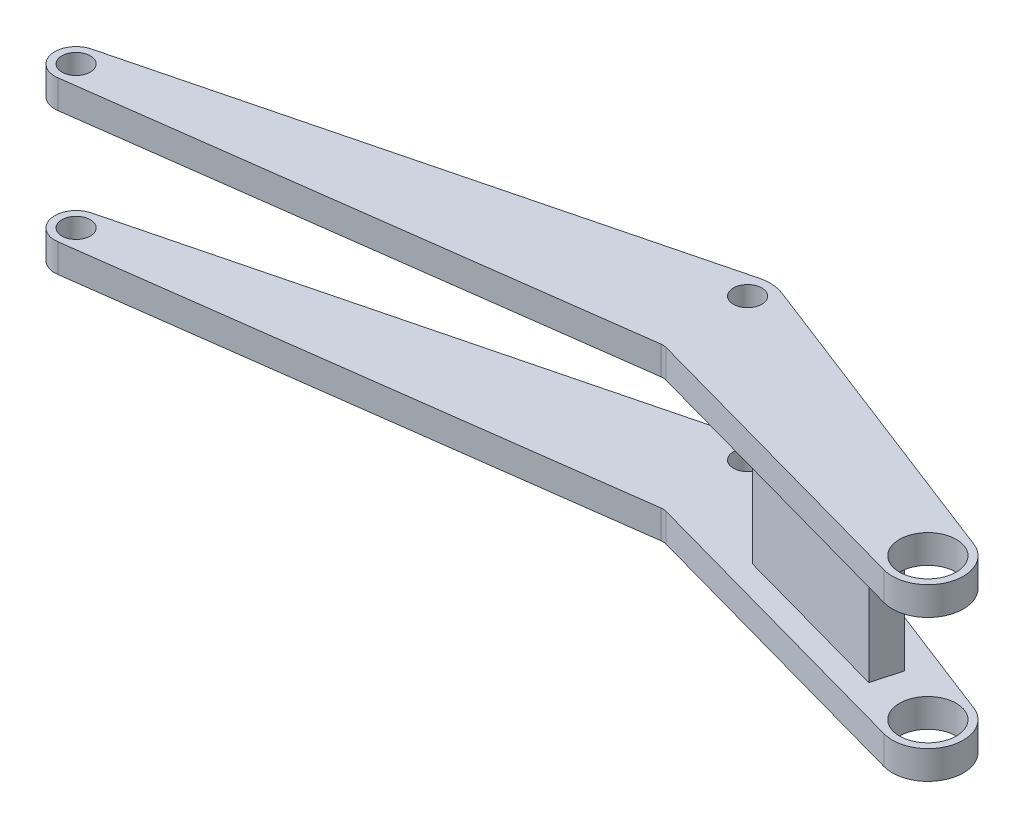
ISO-10303-21;
HEADER;
FILE_DESCRIPTION(('STEP AP214'),'2;1');
FILE_NAME('part.step','',(''),(''),'','','');
FILE_SCHEMA(('AUTOMOTIVE_DESIGN { 1 0 10303 214 1 1 1 1 }'));
ENDSEC;
DATA;
#1=APPLICATION_CONTEXT('core data for automotive mechanical design processes');
#2=APPLICATION_PROTOCOL_DEFINITION('international standard','automotive_design',2000,#1);
#3=PRODUCT_CONTEXT('',#1,'mechanical');
#4=PRODUCT('Part','Part','',(#3));
#5=PRODUCT_RELATED_PRODUCT_CATEGORY('part','',(#4));
#6=PRODUCT_DEFINITION_FORMATION('','',#4);
#7=PRODUCT_DEFINITION_CONTEXT('part definition',#1,'design');
#8=PRODUCT_DEFINITION('design','',#6,#7);
#9=PRODUCT_DEFINITION_SHAPE('','',#8);
#10=(LENGTH_UNIT() NAMED_UNIT(*) SI_UNIT(.MILLI.,.METRE.));
#11=(NAMED_UNIT(*) PLANE_ANGLE_UNIT() SI_UNIT($,.RADIAN.));
#12=(NAMED_UNIT(*) SI_UNIT($,.STERADIAN.) SOLID_ANGLE_UNIT());
#13=UNCERTAINTY_MEASURE_WITH_UNIT(LENGTH_MEASURE(1.E-05),#10,'distance_accuracy_value','');
#14=(GEOMETRIC_REPRESENTATION_CONTEXT(3) GLOBAL_UNCERTAINTY_ASSIGNED_CONTEXT((#13)) GLOBAL_UNIT_ASSIGNED_CONTEXT((#10,
#11,#12)) REPRESENTATION_CONTEXT('',''));
#15=CARTESIAN_POINT('',(0.,0.,0.));
#16=DIRECTION('',(0.,0.,1.));
#17=DIRECTION('',(1.,0.,0.));
#18=AXIS2_PLACEMENT_3D('',#15,#16,#17);
#19=CARTESIAN_POINT('',(-61.8184918272129,60.,0.));
#20=DIRECTION('',(0.,-1.,0.));
#21=DIRECTION('',(0.,0.,-1.));
#22=AXIS2_PLACEMENT_3D('',#19,#20,#21);
#23=CYLINDRICAL_SURFACE('',#22,7.5);
#24=CARTESIAN_POINT('',(-61.8184918272129,10.,0.));
#25=DIRECTION('',(0.,1.,0.));
#26=DIRECTION('',(0.,0.,1.));
#27=AXIS2_PLACEMENT_3D('',#24,#25,#26);
#28=CIRCLE('',#27,7.5);
#29=CARTESIAN_POINT('',(-63.6672105774605,10.,-7.26857888328131));
#30=VERTEX_POINT('',#29);
#31=CARTESIAN_POINT('',(-60.826924457407,10.,7.43416398468155));
#32=VERTEX_POINT('',#31);
#33=EDGE_CURVE('E259',#30,#32,#28,.T.);
#34=ORIENTED_EDGE('',*,*,#33,.F.);
#35=DIRECTION('',(0.,-1.,0.));
#36=VECTOR('',#35,1.);
#37=CARTESIAN_POINT('',(-63.6672105774605,60.,-7.26857888328131));
#38=LINE('',#37,#36);
#39=CARTESIAN_POINT('',(-63.6672105774605,0.,-7.26857888328131));
#40=VERTEX_POINT('',#39);
#41=EDGE_CURVE('E288',#30,#40,#38,.T.);
#42=ORIENTED_EDGE('',*,*,#41,.T.);
#43=CARTESIAN_POINT('',(-61.8184918272129,0.,0.));
#44=DIRECTION('',(0.,1.,0.));
#45=DIRECTION('',(0.,0.,1.));
#46=AXIS2_PLACEMENT_3D('',#43,#44,#45);
#47=CIRCLE('',#46,7.5);
#48=CARTESIAN_POINT('',(-60.826924457407,0.,7.43416398468155));
#49=VERTEX_POINT('',#48);
#50=EDGE_CURVE('E269',#40,#49,#47,.T.);
#51=ORIENTED_EDGE('',*,*,#50,.T.);
#52=DIRECTION('',(0.,-1.,0.));
#53=VECTOR('',#52,1.);
#54=CARTESIAN_POINT('',(-60.826924457407,60.,7.43416398468155));
#55=LINE('',#54,#53);
#56=EDGE_CURVE('E42',#32,#49,#55,.T.);
#57=ORIENTED_EDGE('',*,*,#56,.F.);
#58=EDGE_LOOP('',(#34,#42,#51,#57));
#59=FACE_BOUND('',#58,.T.);
#60=ADVANCED_FACE('F33',(#59),#23,.T.);
#61=CARTESIAN_POINT('',(-60.826924457407,60.,7.43416398468155));
#62=DIRECTION('',(-0.132208982640787,0.,-0.991221864624206));
#63=DIRECTION('',(-0.991221864624206,0.,0.132208982640787));
#64=AXIS2_PLACEMENT_3D('',#61,#62,#63);
#65=PLANE('',#64);
#66=DIRECTION('',(0.991221864624206,0.,-0.132208982640787));
#67=VECTOR('',#66,1.);
#68=CARTESIAN_POINT('',(-60.826924457407,10.,7.43416398468155));
#69=LINE('',#68,#67);
#70=CARTESIAN_POINT('',(126.580977140367,10.,-17.5622660713482));
#71=VERTEX_POINT('',#70);
#72=EDGE_CURVE('E257',#32,#71,#69,.T.);
#73=ORIENTED_EDGE('',*,*,#72,.F.);
#74=ORIENTED_EDGE('',*,*,#56,.T.);
#75=DIRECTION('',(0.991221864624206,0.,-0.132208982640787));
#76=VECTOR('',#75,1.);
#77=CARTESIAN_POINT('',(-60.826924457407,0.,7.43416398468155));
#78=LINE('',#77,#76);
#79=CARTESIAN_POINT('',(126.580977140367,0.,-17.5622660713482));
#80=VERTEX_POINT('',#79);
#81=EDGE_CURVE('E291',#49,#80,#78,.T.);
#82=ORIENTED_EDGE('',*,*,#81,.T.);
#83=DIRECTION('',(0.,-1.,0.));
#84=VECTOR('',#83,1.);
#85=CARTESIAN_POINT('',(126.580977140367,60.,-17.5622660713482));
#86=LINE('',#85,#84);
#87=EDGE_CURVE('E334',#71,#80,#86,.T.);
#88=ORIENTED_EDGE('',*,*,#87,.F.);
#89=EDGE_LOOP('',(#73,#74,#82,#88));
#90=FACE_BOUND('',#89,.T.);
#91=ADVANCED_FACE('F371',(#90),#65,.F.);
#92=CARTESIAN_POINT('',(127.242022053571,60.,-12.6061567482272));
#93=DIRECTION('',(0.,-1.,0.));
#94=DIRECTION('',(0.,0.,-1.));
#95=AXIS2_PLACEMENT_3D('',#92,#93,#94);
#96=CYLINDRICAL_SURFACE('',#95,4.99999999999999);
#97=CARTESIAN_POINT('',(127.242022053571,10.,-12.6061567482272));
#98=DIRECTION('',(0.,1.,0.));
#99=DIRECTION('',(0.,0.,1.));
#100=AXIS2_PLACEMENT_3D('',#97,#98,#99);
#101=CIRCLE('',#100,4.99999999999999);
#102=CARTESIAN_POINT('',(128.578230905402,10.,-17.4243043076414));
#103=VERTEX_POINT('',#102);
#104=EDGE_CURVE('E255',#71,#103,#101,.F.);
#105=ORIENTED_EDGE('',*,*,#104,.F.);
#106=ORIENTED_EDGE('',*,*,#87,.T.);
#107=CARTESIAN_POINT('',(127.242022053571,0.,-12.6061567482272));
#108=DIRECTION('',(0.,-1.,0.));
#109=DIRECTION('',(0.,0.,1.));
#110=AXIS2_PLACEMENT_3D('',#107,#108,#109);
#111=CIRCLE('',#110,4.99999999999999);
#112=CARTESIAN_POINT('',(128.578230905402,0.,-17.4243043076414));
#113=VERTEX_POINT('',#112);
#114=EDGE_CURVE('E294',#80,#113,#111,.T.);
#115=ORIENTED_EDGE('',*,*,#114,.T.);
#116=DIRECTION('',(0.,-1.,0.));
#117=VECTOR('',#116,1.);
#118=CARTESIAN_POINT('',(128.578230905402,60.,-17.4243043076414));
#119=LINE('',#118,#117);
#120=EDGE_CURVE('E330',#103,#113,#119,.T.);
#121=ORIENTED_EDGE('',*,*,#120,.F.);
#122=EDGE_LOOP('',(#105,#106,#115,#121));
#123=FACE_BOUND('',#122,.T.);
#124=ADVANCED_FACE('F376',(#123),#96,.F.);
#125=CARTESIAN_POINT('',(128.578230905402,60.,-17.4243043076414));
#126=DIRECTION('',(0.267241770366172,0.,-0.963629511882837));
#127=DIRECTION('',(-0.963629511882837,0.,-0.267241770366172));
#128=AXIS2_PLACEMENT_3D('',#125,#126,#127);
#129=PLANE('',#128);
#130=DIRECTION('',(0.963629511882837,0.,0.267241770366172));
#131=VECTOR('',#130,1.);
#132=CARTESIAN_POINT('',(128.578230905402,10.,-17.4243043076414));
#133=LINE('',#132,#131);
#134=CARTESIAN_POINT('',(234.84098604321,10.,12.0453688985354));
#135=VERTEX_POINT('',#134);
#136=EDGE_CURVE('E253',#103,#135,#133,.T.);
#137=ORIENTED_EDGE('',*,*,#136,.F.);
#138=ORIENTED_EDGE('',*,*,#120,.T.);
#139=DIRECTION('',(0.963629511882837,0.,0.267241770366172));
#140=VECTOR('',#139,1.);
#141=CARTESIAN_POINT('',(128.578230905402,0.,-17.4243043076414));
#142=LINE('',#141,#140);
#143=CARTESIAN_POINT('',(234.84098604321,0.,12.0453688985354));
#144=VERTEX_POINT('',#143);
#145=EDGE_CURVE('E297',#113,#144,#142,.T.);
#146=ORIENTED_EDGE('',*,*,#145,.T.);
#147=DIRECTION('',(0.,-1.,0.));
#148=VECTOR('',#147,1.);
#149=CARTESIAN_POINT('',(234.84098604321,60.,12.0453688985354));
#150=LINE('',#149,#148);
#151=EDGE_CURVE('E326',#135,#144,#150,.T.);
#152=ORIENTED_EDGE('',*,*,#151,.F.);
#153=EDGE_LOOP('',(#137,#138,#146,#152));
#154=FACE_BOUND('',#153,.T.);
#155=ADVANCED_FACE('F438',(#154),#129,.F.);
#156=CARTESIAN_POINT('',(238.181508172787,60.,0.));
#157=DIRECTION('',(0.,-1.,0.));
#158=DIRECTION('',(0.,0.,-1.));
#159=AXIS2_PLACEMENT_3D('',#156,#157,#158);
#160=CYLINDRICAL_SURFACE('',#159,12.5);
#161=CARTESIAN_POINT('',(238.181508172787,10.,0.));
#162=DIRECTION('',(0.,1.,0.));
#163=DIRECTION('',(0.,0.,1.));
#164=AXIS2_PLACEMENT_3D('',#161,#162,#163);
#165=CIRCLE('',#164,12.5);
#166=CARTESIAN_POINT('',(242.697935990641,10.,-11.6555514569715));
#167=VERTEX_POINT('',#166);
#168=EDGE_CURVE('E251',#135,#167,#165,.T.);
#169=ORIENTED_EDGE('',*,*,#168,.F.);
#170=ORIENTED_EDGE('',*,*,#151,.T.);
#171=CARTESIAN_POINT('',(238.181508172787,0.,0.));
#172=DIRECTION('',(0.,1.,0.));
#173=DIRECTION('',(0.,0.,1.));
#174=AXIS2_PLACEMENT_3D('',#171,#172,#173);
#175=CIRCLE('',#174,12.5);
#176=CARTESIAN_POINT('',(242.697935990641,0.,-11.6555514569715));
#177=VERTEX_POINT('',#176);
#178=EDGE_CURVE('E300',#144,#177,#175,.T.);
#179=ORIENTED_EDGE('',*,*,#178,.T.);
#180=DIRECTION('',(0.,-1.,0.));
#181=VECTOR('',#180,1.);
#182=CARTESIAN_POINT('',(242.697935990641,60.,-11.6555514569715));
#183=LINE('',#182,#181);
#184=EDGE_CURVE('E322',#167,#177,#183,.T.);
#185=ORIENTED_EDGE('',*,*,#184,.F.);
#186=EDGE_LOOP('',(#169,#170,#179,#185));
#187=FACE_BOUND('',#186,.T.);
#188=ADVANCED_FACE('F435',(#187),#160,.T.);
#189=CARTESIAN_POINT('',(132.300421209568,60.,-54.4336566903369));
#190=DIRECTION('',(-0.361314225428352,0.,0.932444116557722));
#191=DIRECTION('',(0.932444116557722,0.,0.361314225428352));
#192=AXIS2_PLACEMENT_3D('',#189,#190,#191);
#193=PLANE('',#192);
#194=DIRECTION('',(-0.932444116557722,0.,-0.361314225428352));
#195=VECTOR('',#194,1.);
#196=CARTESIAN_POINT('',(132.300421209568,10.,-54.4336566903369));
#197=LINE('',#196,#195);
#198=CARTESIAN_POINT('',(132.300421209568,10.,-54.4336566903369));
#199=VERTEX_POINT('',#198);
#200=EDGE_CURVE('E249',#167,#199,#197,.T.);
#201=ORIENTED_EDGE('',*,*,#200,.F.);
#202=ORIENTED_EDGE('',*,*,#184,.T.);
#203=DIRECTION('',(-0.932444116557722,0.,-0.361314225428352));
#204=VECTOR('',#203,1.);
#205=CARTESIAN_POINT('',(132.300421209568,0.,-54.4336566903369));
#206=LINE('',#205,#204);
#207=CARTESIAN_POINT('',(132.300421209568,0.,-54.4336566903369));
#208=VERTEX_POINT('',#207);
#209=EDGE_CURVE('E303',#177,#208,#206,.T.);
#210=ORIENTED_EDGE('',*,*,#209,.T.);
#211=DIRECTION('',(0.,-1.,0.));
#212=VECTOR('',#211,1.);
#213=CARTESIAN_POINT('',(132.300421209568,60.,-54.4336566903369));
#214=LINE('',#213,#212);
#215=EDGE_CURVE('E318',#199,#208,#214,.T.);
#216=ORIENTED_EDGE('',*,*,#215,.F.);
#217=EDGE_LOOP('',(#201,#202,#210,#216));
#218=FACE_BOUND('',#217,.T.);
#219=ADVANCED_FACE('F432',(#218),#193,.F.);
#220=CARTESIAN_POINT('',(127.242022053571,60.,-41.3794390585288));
#221=DIRECTION('',(0.,-1.,0.));
#222=DIRECTION('',(0.,0.,-1.));
#223=AXIS2_PLACEMENT_3D('',#220,#221,#222);
#224=CYLINDRICAL_SURFACE('',#223,14.);
#225=CARTESIAN_POINT('',(127.242022053571,10.,-41.3794390585288));
#226=DIRECTION('',(0.,1.,0.));
#227=DIRECTION('',(0.,0.,1.));
#228=AXIS2_PLACEMENT_3D('',#225,#226,#227);
#229=CIRCLE('',#228,14.);
#230=CARTESIAN_POINT('',(123.791080386442,10.,-54.9474529739872));
#231=VERTEX_POINT('',#230);
#232=EDGE_CURVE('E50',#199,#231,#229,.T.);
#233=ORIENTED_EDGE('',*,*,#232,.F.);
#234=ORIENTED_EDGE('',*,*,#215,.T.);
#235=CARTESIAN_POINT('',(127.242022053571,0.,-41.3794390585288));
#236=DIRECTION('',(0.,1.,0.));
#237=DIRECTION('',(0.,0.,1.));
#238=AXIS2_PLACEMENT_3D('',#235,#236,#237);
#239=CIRCLE('',#238,14.);
#240=CARTESIAN_POINT('',(123.791080386442,0.,-54.9474529739872));
#241=VERTEX_POINT('',#240);
#242=EDGE_CURVE('E306',#208,#241,#239,.T.);
#243=ORIENTED_EDGE('',*,*,#242,.T.);
#244=DIRECTION('',(0.,-1.,0.));
#245=VECTOR('',#244,1.);
#246=CARTESIAN_POINT('',(123.791080386442,60.,-54.9474529739872));
#247=LINE('',#246,#245);
#248=EDGE_CURVE('E314',#231,#241,#247,.T.);
#249=ORIENTED_EDGE('',*,*,#248,.F.);
#250=EDGE_LOOP('',(#233,#234,#243,#249));
#251=FACE_BOUND('',#250,.T.);
#252=ADVANCED_FACE('F429',(#251),#224,.T.);
#253=CARTESIAN_POINT('',(-63.6672105774605,60.,-7.26857888328131));
#254=DIRECTION('',(0.246495833366344,0.,0.969143851104175));
#255=DIRECTION('',(0.969143851104175,0.,-0.246495833366344));
#256=AXIS2_PLACEMENT_3D('',#253,#254,#255);
#257=PLANE('',#256);
#258=DIRECTION('',(-0.969143851104175,0.,0.246495833366344));
#259=VECTOR('',#258,1.);
#260=CARTESIAN_POINT('',(-63.6672105774605,10.,-7.26857888328131));
#261=LINE('',#260,#259);
#262=EDGE_CURVE('E246',#231,#30,#261,.T.);
#263=ORIENTED_EDGE('',*,*,#262,.F.);
#264=ORIENTED_EDGE('',*,*,#248,.T.);
#265=DIRECTION('',(-0.969143851104175,0.,0.246495833366344));
#266=VECTOR('',#265,1.);
#267=CARTESIAN_POINT('',(-63.6672105774605,0.,-7.26857888328131));
#268=LINE('',#267,#266);
#269=EDGE_CURVE('E274',#241,#40,#268,.T.);
#270=ORIENTED_EDGE('',*,*,#269,.T.);
#271=ORIENTED_EDGE('',*,*,#41,.F.);
#272=EDGE_LOOP('',(#263,#264,#270,#271));
#273=FACE_BOUND('',#272,.T.);
#274=ADVANCED_FACE('F360',(#273),#257,.F.);
#275=CARTESIAN_POINT('',(-61.8184918272129,-68.5,0.));
#276=DIRECTION('',(0.,1.,0.));
#277=DIRECTION('',(0.,0.,1.));
#278=AXIS2_PLACEMENT_3D('',#275,#276,#277);
#279=CYLINDRICAL_SURFACE('',#278,5.);
#280=CARTESIAN_POINT('',(-61.8184918272129,0.,0.));
#281=DIRECTION('',(0.,1.,0.));
#282=DIRECTION('',(0.,0.,1.));
#283=AXIS2_PLACEMENT_3D('',#280,#281,#282);
#284=CIRCLE('',#283,5.);
#285=CARTESIAN_POINT('',(-61.8184918272129,0.,5.));
#286=VERTEX_POINT('',#285);
#287=EDGE_CURVE('E261',#286,#286,#284,.T.);
#288=ORIENTED_EDGE('',*,*,#287,.F.);
#289=EDGE_LOOP('',(#288));
#290=FACE_BOUND('',#289,.T.);
#291=CARTESIAN_POINT('',(-61.8184918272129,10.,0.));
#292=DIRECTION('',(0.,1.,0.));
#293=DIRECTION('',(0.,0.,1.));
#294=AXIS2_PLACEMENT_3D('',#291,#292,#293);
#295=CIRCLE('',#294,5.);
#296=CARTESIAN_POINT('',(-61.8184918272129,10.,5.));
#297=VERTEX_POINT('',#296);
#298=EDGE_CURVE('E243',#297,#297,#295,.F.);
#299=ORIENTED_EDGE('',*,*,#298,.F.);
#300=EDGE_LOOP('',(#299));
#301=FACE_BOUND('',#300,.T.);
#302=ADVANCED_FACE('F350',(#290,#301),#279,.F.);
#303=CARTESIAN_POINT('',(238.181508172787,-68.5,0.));
#304=DIRECTION('',(0.,1.,0.));
#305=DIRECTION('',(0.,0.,1.));
#306=AXIS2_PLACEMENT_3D('',#303,#304,#305);
#307=CYLINDRICAL_SURFACE('',#306,10.);
#308=CARTESIAN_POINT('',(238.181508172787,0.,0.));
#309=DIRECTION('',(0.,1.,0.));
#310=DIRECTION('',(0.,0.,1.));
#311=AXIS2_PLACEMENT_3D('',#308,#309,#310);
#312=CIRCLE('',#311,10.);
#313=CARTESIAN_POINT('',(238.181508172787,0.,10.));
#314=VERTEX_POINT('',#313);
#315=EDGE_CURVE('E265',#314,#314,#312,.T.);
#316=ORIENTED_EDGE('',*,*,#315,.F.);
#317=EDGE_LOOP('',(#316));
#318=FACE_BOUND('',#317,.T.);
#319=CARTESIAN_POINT('',(238.181508172787,10.,0.));
#320=DIRECTION('',(0.,1.,0.));
#321=DIRECTION('',(0.,0.,1.));
#322=AXIS2_PLACEMENT_3D('',#319,#320,#321);
#323=CIRCLE('',#322,10.);
#324=CARTESIAN_POINT('',(238.181508172787,10.,10.));
#325=VERTEX_POINT('',#324);
#326=EDGE_CURVE('E242',#325,#325,#323,.F.);
#327=ORIENTED_EDGE('',*,*,#326,.F.);
#328=EDGE_LOOP('',(#327));
#329=FACE_BOUND('',#328,.T.);
#330=ADVANCED_FACE('F347',(#318,#329),#307,.F.);
#331=CARTESIAN_POINT('',(-61.8184918272129,0.,0.));
#332=DIRECTION('',(0.,1.,0.));
#333=DIRECTION('',(0.,0.,1.));
#334=AXIS2_PLACEMENT_3D('',#331,#332,#333);
#335=PLANE('',#334);
#336=CARTESIAN_POINT('',(127.242022053571,0.,-47.441126230127));
#337=DIRECTION('',(0.,1.,0.));
#338=DIRECTION('',(0.,0.,1.));
#339=AXIS2_PLACEMENT_3D('',#336,#337,#338);
#340=CIRCLE('',#339,4.99999999999999);
#341=CARTESIAN_POINT('',(127.242022053571,0.,-42.441126230127));
#342=VERTEX_POINT('',#341);
#343=EDGE_CURVE('E203',#342,#342,#340,.T.);
#344=ORIENTED_EDGE('',*,*,#343,.T.);
#345=EDGE_LOOP('',(#344));
#346=FACE_BOUND('',#345,.T.);
#347=ORIENTED_EDGE('',*,*,#315,.T.);
#348=EDGE_LOOP('',(#347));
#349=FACE_BOUND('',#348,.T.);
#350=ORIENTED_EDGE('',*,*,#287,.T.);
#351=EDGE_LOOP('',(#350));
#352=FACE_BOUND('',#351,.T.);
#353=ORIENTED_EDGE('',*,*,#50,.F.);
#354=ORIENTED_EDGE('',*,*,#269,.F.);
#355=ORIENTED_EDGE('',*,*,#242,.F.);
#356=ORIENTED_EDGE('',*,*,#209,.F.);
#357=ORIENTED_EDGE('',*,*,#178,.F.);
#358=ORIENTED_EDGE('',*,*,#145,.F.);
#359=ORIENTED_EDGE('',*,*,#114,.F.);
#360=ORIENTED_EDGE('',*,*,#81,.F.);
#361=EDGE_LOOP('',(#353,#354,#355,#356,#357,#358,#359,#360));
#362=FACE_BOUND('',#361,.T.);
#363=ADVANCED_FACE('F349',(#346,#349,#352,#362),#335,.F.);
#364=CARTESIAN_POINT('',(0.,10.,0.));
#365=DIRECTION('',(0.,1.,0.));
#366=DIRECTION('',(0.,0.,1.));
#367=AXIS2_PLACEMENT_3D('',#364,#365,#366);
#368=PLANE('',#367);
#369=CARTESIAN_POINT('',(127.242022053571,10.,-47.441126230127));
#370=DIRECTION('',(0.,1.,0.));
#371=DIRECTION('',(0.,0.,1.));
#372=AXIS2_PLACEMENT_3D('',#369,#370,#371);
#373=CIRCLE('',#372,4.99999999999999);
#374=CARTESIAN_POINT('',(127.242022053571,10.,-42.441126230127));
#375=VERTEX_POINT('',#374);
#376=EDGE_CURVE('E672',#375,#375,#373,.T.);
#377=ORIENTED_EDGE('',*,*,#376,.F.);
#378=EDGE_LOOP('',(#377));
#379=FACE_BOUND('',#378,.T.);
#380=ORIENTED_EDGE('',*,*,#298,.T.);
#381=EDGE_LOOP('',(#380));
#382=FACE_BOUND('',#381,.T.);
#383=ORIENTED_EDGE('',*,*,#326,.T.);
#384=EDGE_LOOP('',(#383));
#385=FACE_BOUND('',#384,.T.);
#386=DIRECTION('',(-0.932444116557722,0.,-0.361314225428352));
#387=VECTOR('',#386,1.);
#388=CARTESIAN_POINT('',(219.199055148742,10.,-10.7417659280512));
#389=LINE('',#388,#387);
#390=CARTESIAN_POINT('',(219.199055148742,10.,-10.7417659280512));
#391=VERTEX_POINT('',#390);
#392=CARTESIAN_POINT('',(164.034407851245,10.,-32.117601171567));
#393=VERTEX_POINT('',#392);
#394=EDGE_CURVE('E183',#391,#393,#389,.T.);
#395=ORIENTED_EDGE('',*,*,#394,.F.);
#396=DIRECTION('',(0.267241770366172,0.,-0.963629511882837));
#397=VECTOR('',#396,1.);
#398=CARTESIAN_POINT('',(216.469846147847,10.,-0.900690808114779));
#399=LINE('',#398,#397);
#400=CARTESIAN_POINT('',(216.469846147847,10.,-0.900690808114772));
#401=VERTEX_POINT('',#400);
#402=EDGE_CURVE('E192',#401,#391,#399,.T.);
#403=ORIENTED_EDGE('',*,*,#402,.F.);
#404=DIRECTION('',(0.963629511882837,0.,0.267241770366172));
#405=VECTOR('',#404,1.);
#406=CARTESIAN_POINT('',(159.740207612292,10.,-16.6334271424893));
#407=LINE('',#406,#405);
#408=CARTESIAN_POINT('',(159.740207612292,10.,-16.6334271424893));
#409=VERTEX_POINT('',#408);
#410=EDGE_CURVE('E176',#409,#401,#407,.T.);
#411=ORIENTED_EDGE('',*,*,#410,.F.);
#412=DIRECTION('',(-0.267241770366173,0.,0.963629511882837));
#413=VECTOR('',#412,1.);
#414=CARTESIAN_POINT('',(164.034407851245,10.,-32.117601171567));
#415=LINE('',#414,#413);
#416=EDGE_CURVE('E189',#393,#409,#415,.T.);
#417=ORIENTED_EDGE('',*,*,#416,.F.);
#418=EDGE_LOOP('',(#395,#403,#411,#417));
#419=FACE_BOUND('',#418,.T.);
#420=ORIENTED_EDGE('',*,*,#33,.T.);
#421=ORIENTED_EDGE('',*,*,#72,.T.);
#422=ORIENTED_EDGE('',*,*,#104,.T.);
#423=ORIENTED_EDGE('',*,*,#136,.T.);
#424=ORIENTED_EDGE('',*,*,#168,.T.);
#425=ORIENTED_EDGE('',*,*,#200,.T.);
#426=ORIENTED_EDGE('',*,*,#232,.T.);
#427=ORIENTED_EDGE('',*,*,#262,.T.);
#428=EDGE_LOOP('',(#420,#421,#422,#423,#424,#425,#426,#427));
#429=FACE_BOUND('',#428,.T.);
#430=ADVANCED_FACE('F188',(#379,#382,#385,#419,#429),#368,.T.);
#431=CARTESIAN_POINT('',(0.,50.,0.));
#432=DIRECTION('',(0.,1.,0.));
#433=DIRECTION('',(0.,0.,1.));
#434=AXIS2_PLACEMENT_3D('',#431,#432,#433);
#435=PLANE('',#434);
#436=CARTESIAN_POINT('',(127.242022053571,50.,-47.441126230127));
#437=DIRECTION('',(0.,1.,0.));
#438=DIRECTION('',(0.,0.,1.));
#439=AXIS2_PLACEMENT_3D('',#436,#437,#438);
#440=CIRCLE('',#439,4.99999999999999);
#441=CARTESIAN_POINT('',(127.242022053571,50.,-42.441126230127));
#442=VERTEX_POINT('',#441);
#443=EDGE_CURVE('E675',#442,#442,#440,.T.);
#444=ORIENTED_EDGE('',*,*,#443,.T.);
#445=EDGE_LOOP('',(#444));
#446=FACE_BOUND('',#445,.T.);
#447=CARTESIAN_POINT('',(-61.8184918272129,50.,0.));
#448=DIRECTION('',(0.,1.,0.));
#449=DIRECTION('',(0.,0.,1.));
#450=AXIS2_PLACEMENT_3D('',#447,#448,#449);
#451=CIRCLE('',#450,5.);
#452=CARTESIAN_POINT('',(-61.8184918272129,50.,5.));
#453=VERTEX_POINT('',#452);
#454=EDGE_CURVE('E218',#453,#453,#451,.F.);
#455=ORIENTED_EDGE('',*,*,#454,.F.);
#456=EDGE_LOOP('',(#455));
#457=FACE_BOUND('',#456,.T.);
#458=DIRECTION('',(-0.267241770366173,0.,0.963629511882837));
#459=VECTOR('',#458,1.);
#460=CARTESIAN_POINT('',(164.034407851245,50.,-32.117601171567));
#461=LINE('',#460,#459);
#462=CARTESIAN_POINT('',(164.034407851245,50.,-32.117601171567));
#463=VERTEX_POINT('',#462);
#464=CARTESIAN_POINT('',(159.740207612292,50.,-16.6334271424893));
#465=VERTEX_POINT('',#464);
#466=EDGE_CURVE('E208',#463,#465,#461,.T.);
#467=ORIENTED_EDGE('',*,*,#466,.T.);
#468=DIRECTION('',(0.963629511882837,0.,0.267241770366172));
#469=VECTOR('',#468,1.);
#470=CARTESIAN_POINT('',(159.740207612292,50.,-16.6334271424893));
#471=LINE('',#470,#469);
#472=CARTESIAN_POINT('',(216.469846147847,50.,-0.900690808114779));
#473=VERTEX_POINT('',#472);
#474=EDGE_CURVE('E178',#465,#473,#471,.T.);
#475=ORIENTED_EDGE('',*,*,#474,.T.);
#476=DIRECTION('',(0.267241770366172,0.,-0.963629511882837));
#477=VECTOR('',#476,1.);
#478=CARTESIAN_POINT('',(216.469846147847,50.,-0.900690808114779));
#479=LINE('',#478,#477);
#480=CARTESIAN_POINT('',(219.199055148742,50.,-10.7417659280512));
#481=VERTEX_POINT('',#480);
#482=EDGE_CURVE('E200',#473,#481,#479,.T.);
#483=ORIENTED_EDGE('',*,*,#482,.T.);
#484=DIRECTION('',(-0.932444116557722,0.,-0.361314225428352));
#485=VECTOR('',#484,1.);
#486=CARTESIAN_POINT('',(219.199055148742,50.,-10.7417659280512));
#487=LINE('',#486,#485);
#488=EDGE_CURVE('E197',#481,#463,#487,.T.);
#489=ORIENTED_EDGE('',*,*,#488,.T.);
#490=EDGE_LOOP('',(#467,#475,#483,#489));
#491=FACE_BOUND('',#490,.T.);
#492=CARTESIAN_POINT('',(238.181508172787,50.,0.));
#493=DIRECTION('',(0.,1.,0.));
#494=DIRECTION('',(0.,0.,1.));
#495=AXIS2_PLACEMENT_3D('',#492,#493,#494);
#496=CIRCLE('',#495,10.);
#497=CARTESIAN_POINT('',(238.181508172787,50.,10.));
#498=VERTEX_POINT('',#497);
#499=EDGE_CURVE('E214',#498,#498,#496,.F.);
#500=ORIENTED_EDGE('',*,*,#499,.F.);
#501=EDGE_LOOP('',(#500));
#502=FACE_BOUND('',#501,.T.);
#503=DIRECTION('',(-0.969143851104175,0.,0.246495833366344));
#504=VECTOR('',#503,1.);
#505=CARTESIAN_POINT('',(-63.6672105774605,50.,-7.26857888328131));
#506=LINE('',#505,#504);
#507=CARTESIAN_POINT('',(123.791080386442,50.,-54.9474529739872));
#508=VERTEX_POINT('',#507);
#509=CARTESIAN_POINT('',(-63.6672105774605,50.,-7.26857888328131));
#510=VERTEX_POINT('',#509);
#511=EDGE_CURVE('E221',#508,#510,#506,.T.);
#512=ORIENTED_EDGE('',*,*,#511,.F.);
#513=CARTESIAN_POINT('',(127.242022053571,50.,-41.3794390585288));
#514=DIRECTION('',(0.,1.,0.));
#515=DIRECTION('',(0.,0.,1.));
#516=AXIS2_PLACEMENT_3D('',#513,#514,#515);
#517=CIRCLE('',#516,14.);
#518=CARTESIAN_POINT('',(132.300421209568,50.,-54.4336566903369));
#519=VERTEX_POINT('',#518);
#520=EDGE_CURVE('E223',#519,#508,#517,.T.);
#521=ORIENTED_EDGE('',*,*,#520,.F.);
#522=DIRECTION('',(-0.932444116557722,0.,-0.361314225428352));
#523=VECTOR('',#522,1.);
#524=CARTESIAN_POINT('',(132.300421209568,50.,-54.4336566903369));
#525=LINE('',#524,#523);
#526=CARTESIAN_POINT('',(242.697935990641,50.,-11.6555514569715));
#527=VERTEX_POINT('',#526);
#528=EDGE_CURVE('E226',#527,#519,#525,.T.);
#529=ORIENTED_EDGE('',*,*,#528,.F.);
#530=CARTESIAN_POINT('',(238.181508172787,50.,0.));
#531=DIRECTION('',(0.,1.,0.));
#532=DIRECTION('',(0.,0.,1.));
#533=AXIS2_PLACEMENT_3D('',#530,#531,#532);
#534=CIRCLE('',#533,12.5);
#535=CARTESIAN_POINT('',(234.84098604321,50.,12.0453688985354));
#536=VERTEX_POINT('',#535);
#537=EDGE_CURVE('E229',#536,#527,#534,.T.);
#538=ORIENTED_EDGE('',*,*,#537,.F.);
#539=DIRECTION('',(0.963629511882837,0.,0.267241770366172));
#540=VECTOR('',#539,1.);
#541=CARTESIAN_POINT('',(128.578230905402,50.,-17.4243043076414));
#542=LINE('',#541,#540);
#543=CARTESIAN_POINT('',(128.578230905402,50.,-17.4243043076414));
#544=VERTEX_POINT('',#543);
#545=EDGE_CURVE('E232',#544,#536,#542,.T.);
#546=ORIENTED_EDGE('',*,*,#545,.F.);
#547=CARTESIAN_POINT('',(127.242022053571,50.,-12.6061567482272));
#548=DIRECTION('',(0.,1.,0.));
#549=DIRECTION('',(0.,0.,1.));
#550=AXIS2_PLACEMENT_3D('',#547,#548,#549);
#551=CIRCLE('',#550,4.99999999999999);
#552=CARTESIAN_POINT('',(126.580977140367,50.,-17.5622660713482));
#553=VERTEX_POINT('',#552);
#554=EDGE_CURVE('E235',#553,#544,#551,.F.);
#555=ORIENTED_EDGE('',*,*,#554,.F.);
#556=DIRECTION('',(0.991221864624206,0.,-0.132208982640787));
#557=VECTOR('',#556,1.);
#558=CARTESIAN_POINT('',(-60.826924457407,50.,7.43416398468155));
#559=LINE('',#558,#557);
#560=CARTESIAN_POINT('',(-60.826924457407,50.,7.43416398468155));
#561=VERTEX_POINT('',#560);
#562=EDGE_CURVE('E238',#561,#553,#559,.T.);
#563=ORIENTED_EDGE('',*,*,#562,.F.);
#564=CARTESIAN_POINT('',(-61.8184918272129,50.,0.));
#565=DIRECTION('',(0.,1.,0.));
#566=DIRECTION('',(0.,0.,1.));
#567=AXIS2_PLACEMENT_3D('',#564,#565,#566);
#568=CIRCLE('',#567,7.5);
#569=EDGE_CURVE('E58',#510,#561,#568,.T.);
#570=ORIENTED_EDGE('',*,*,#569,.F.);
#571=EDGE_LOOP('',(#512,#521,#529,#538,#546,#555,#563,#570));
#572=FACE_BOUND('',#571,.T.);
#573=ADVANCED_FACE('F396',(#446,#457,#491,#502,#572),#435,.F.);
#574=CARTESIAN_POINT('',(164.034407851245,10.,-32.117601171567));
#575=DIRECTION('',(-0.963629511882837,0.,-0.267241770366173));
#576=DIRECTION('',(-0.267241770366173,0.,0.963629511882837));
#577=AXIS2_PLACEMENT_3D('',#574,#575,#576);
#578=PLANE('',#577);
#579=ORIENTED_EDGE('',*,*,#466,.F.);
#580=DIRECTION('',(0.,1.,0.));
#581=VECTOR('',#580,1.);
#582=CARTESIAN_POINT('',(164.034407851245,10.,-32.117601171567));
#583=LINE('',#582,#581);
#584=EDGE_CURVE('E196',#393,#463,#583,.T.);
#585=ORIENTED_EDGE('',*,*,#584,.F.);
#586=ORIENTED_EDGE('',*,*,#416,.T.);
#587=DIRECTION('',(0.,1.,0.));
#588=VECTOR('',#587,1.);
#589=CARTESIAN_POINT('',(159.740207612292,10.,-16.6334271424893));
#590=LINE('',#589,#588);
#591=EDGE_CURVE('E173',#409,#465,#590,.T.);
#592=ORIENTED_EDGE('',*,*,#591,.T.);
#593=EDGE_LOOP('',(#579,#585,#586,#592));
#594=FACE_BOUND('',#593,.T.);
#595=ADVANCED_FACE('F195',(#594),#578,.T.);
#596=CARTESIAN_POINT('',(219.199055148742,10.,-10.7417659280512));
#597=DIRECTION('',(0.361314225428352,0.,-0.932444116557722));
#598=DIRECTION('',(-0.932444116557722,0.,-0.361314225428352));
#599=AXIS2_PLACEMENT_3D('',#596,#597,#598);
#600=PLANE('',#599);
#601=ORIENTED_EDGE('',*,*,#488,.F.);
#602=DIRECTION('',(0.,1.,0.));
#603=VECTOR('',#602,1.);
#604=CARTESIAN_POINT('',(219.199055148742,10.,-10.7417659280512));
#605=LINE('',#604,#603);
#606=EDGE_CURVE('E215',#391,#481,#605,.T.);
#607=ORIENTED_EDGE('',*,*,#606,.F.);
#608=ORIENTED_EDGE('',*,*,#394,.T.);
#609=ORIENTED_EDGE('',*,*,#584,.T.);
#610=EDGE_LOOP('',(#601,#607,#608,#609));
#611=FACE_BOUND('',#610,.T.);
#612=ADVANCED_FACE('F530',(#611),#600,.T.);
#613=CARTESIAN_POINT('',(216.469846147847,10.,-0.900690808114779));
#614=DIRECTION('',(0.963629511882837,0.,0.267241770366172));
#615=DIRECTION('',(0.267241770366172,0.,-0.963629511882837));
#616=AXIS2_PLACEMENT_3D('',#613,#614,#615);
#617=PLANE('',#616);
#618=ORIENTED_EDGE('',*,*,#482,.F.);
#619=DIRECTION('',(0.,1.,0.));
#620=VECTOR('',#619,1.);
#621=CARTESIAN_POINT('',(216.469846147847,10.,-0.900690808114779));
#622=LINE('',#621,#620);
#623=EDGE_CURVE('E182',#401,#473,#622,.T.);
#624=ORIENTED_EDGE('',*,*,#623,.F.);
#625=ORIENTED_EDGE('',*,*,#402,.T.);
#626=ORIENTED_EDGE('',*,*,#606,.T.);
#627=EDGE_LOOP('',(#618,#624,#625,#626));
#628=FACE_BOUND('',#627,.T.);
#629=ADVANCED_FACE('F538',(#628),#617,.T.);
#630=CARTESIAN_POINT('',(159.740207612292,10.,-16.6334271424893));
#631=DIRECTION('',(-0.267241770366172,0.,0.963629511882837));
#632=DIRECTION('',(0.963629511882837,0.,0.267241770366172));
#633=AXIS2_PLACEMENT_3D('',#630,#631,#632);
#634=PLANE('',#633);
#635=ORIENTED_EDGE('',*,*,#474,.F.);
#636=ORIENTED_EDGE('',*,*,#591,.F.);
#637=ORIENTED_EDGE('',*,*,#410,.T.);
#638=ORIENTED_EDGE('',*,*,#623,.T.);
#639=EDGE_LOOP('',(#635,#636,#637,#638));
#640=FACE_BOUND('',#639,.T.);
#641=ADVANCED_FACE('F175',(#640),#634,.T.);
#642=CARTESIAN_POINT('',(123.791080386442,60.,-54.9474529739872));
#643=VERTEX_POINT('',#642);
#644=EDGE_CURVE('E315',#643,#508,#247,.T.);
#645=ORIENTED_EDGE('',*,*,#644,.T.);
#646=ORIENTED_EDGE('',*,*,#511,.T.);
#647=CARTESIAN_POINT('',(-63.6672105774605,60.,-7.26857888328131));
#648=VERTEX_POINT('',#647);
#649=EDGE_CURVE('E311',#648,#510,#38,.T.);
#650=ORIENTED_EDGE('',*,*,#649,.F.);
#651=DIRECTION('',(-0.969143851104175,0.,0.246495833366344));
#652=VECTOR('',#651,1.);
#653=CARTESIAN_POINT('',(-63.6672105774605,60.,-7.26857888328131));
#654=LINE('',#653,#652);
#655=EDGE_CURVE('E286',#643,#648,#654,.T.);
#656=ORIENTED_EDGE('',*,*,#655,.F.);
#657=EDGE_LOOP('',(#645,#646,#650,#656));
#658=FACE_BOUND('',#657,.T.);
#659=ADVANCED_FACE('F394',(#658),#257,.F.);
#660=CARTESIAN_POINT('',(132.300421209568,60.,-54.4336566903369));
#661=VERTEX_POINT('',#660);
#662=EDGE_CURVE('E319',#661,#519,#214,.T.);
#663=ORIENTED_EDGE('',*,*,#662,.T.);
#664=ORIENTED_EDGE('',*,*,#520,.T.);
#665=ORIENTED_EDGE('',*,*,#644,.F.);
#666=CARTESIAN_POINT('',(127.242022053571,60.,-41.3794390585288));
#667=DIRECTION('',(0.,1.,0.));
#668=DIRECTION('',(0.,0.,1.));
#669=AXIS2_PLACEMENT_3D('',#666,#667,#668);
#670=CIRCLE('',#669,14.);
#671=EDGE_CURVE('E284',#661,#643,#670,.T.);
#672=ORIENTED_EDGE('',*,*,#671,.F.);
#673=EDGE_LOOP('',(#663,#664,#665,#672));
#674=FACE_BOUND('',#673,.T.);
#675=ADVANCED_FACE('F398',(#674),#224,.T.);
#676=CARTESIAN_POINT('',(242.697935990641,60.,-11.6555514569715));
#677=VERTEX_POINT('',#676);
#678=EDGE_CURVE('E323',#677,#527,#183,.T.);
#679=ORIENTED_EDGE('',*,*,#678,.T.);
#680=ORIENTED_EDGE('',*,*,#528,.T.);
#681=ORIENTED_EDGE('',*,*,#662,.F.);
#682=DIRECTION('',(-0.932444116557722,0.,-0.361314225428352));
#683=VECTOR('',#682,1.);
#684=CARTESIAN_POINT('',(132.300421209568,60.,-54.4336566903369));
#685=LINE('',#684,#683);
#686=EDGE_CURVE('E282',#677,#661,#685,.T.);
#687=ORIENTED_EDGE('',*,*,#686,.F.);
#688=EDGE_LOOP('',(#679,#680,#681,#687));
#689=FACE_BOUND('',#688,.T.);
#690=ADVANCED_FACE('F403',(#689),#193,.F.);
#691=CARTESIAN_POINT('',(234.84098604321,60.,12.0453688985354));
#692=VERTEX_POINT('',#691);
#693=EDGE_CURVE('E327',#692,#536,#150,.T.);
#694=ORIENTED_EDGE('',*,*,#693,.T.);
#695=ORIENTED_EDGE('',*,*,#537,.T.);
#696=ORIENTED_EDGE('',*,*,#678,.F.);
#697=CARTESIAN_POINT('',(238.181508172787,60.,0.));
#698=DIRECTION('',(0.,1.,0.));
#699=DIRECTION('',(0.,0.,1.));
#700=AXIS2_PLACEMENT_3D('',#697,#698,#699);
#701=CIRCLE('',#700,12.5);
#702=EDGE_CURVE('E280',#692,#677,#701,.T.);
#703=ORIENTED_EDGE('',*,*,#702,.F.);
#704=EDGE_LOOP('',(#694,#695,#696,#703));
#705=FACE_BOUND('',#704,.T.);
#706=ADVANCED_FACE('F406',(#705),#160,.T.);
#707=CARTESIAN_POINT('',(128.578230905402,60.,-17.4243043076414));
#708=VERTEX_POINT('',#707);
#709=EDGE_CURVE('E331',#708,#544,#119,.T.);
#710=ORIENTED_EDGE('',*,*,#709,.T.);
#711=ORIENTED_EDGE('',*,*,#545,.T.);
#712=ORIENTED_EDGE('',*,*,#693,.F.);
#713=DIRECTION('',(0.963629511882837,0.,0.267241770366172));
#714=VECTOR('',#713,1.);
#715=CARTESIAN_POINT('',(128.578230905402,60.,-17.4243043076414));
#716=LINE('',#715,#714);
#717=EDGE_CURVE('E278',#708,#692,#716,.T.);
#718=ORIENTED_EDGE('',*,*,#717,.F.);
#719=EDGE_LOOP('',(#710,#711,#712,#718));
#720=FACE_BOUND('',#719,.T.);
#721=ADVANCED_FACE('F411',(#720),#129,.F.);
#722=CARTESIAN_POINT('',(126.580977140367,60.,-17.5622660713482));
#723=VERTEX_POINT('',#722);
#724=EDGE_CURVE('E335',#723,#553,#86,.T.);
#725=ORIENTED_EDGE('',*,*,#724,.T.);
#726=ORIENTED_EDGE('',*,*,#554,.T.);
#727=ORIENTED_EDGE('',*,*,#709,.F.);
#728=CARTESIAN_POINT('',(127.242022053571,60.,-12.6061567482272));
#729=DIRECTION('',(0.,-1.,0.));
#730=DIRECTION('',(0.,0.,1.));
#731=AXIS2_PLACEMENT_3D('',#728,#729,#730);
#732=CIRCLE('',#731,4.99999999999999);
#733=EDGE_CURVE('E276',#723,#708,#732,.T.);
#734=ORIENTED_EDGE('',*,*,#733,.F.);
#735=EDGE_LOOP('',(#725,#726,#727,#734));
#736=FACE_BOUND('',#735,.T.);
#737=ADVANCED_FACE('F387',(#736),#96,.F.);
#738=CARTESIAN_POINT('',(-60.826924457407,60.,7.43416398468155));
#739=VERTEX_POINT('',#738);
#740=EDGE_CURVE('E11',#739,#561,#55,.T.);
#741=ORIENTED_EDGE('',*,*,#740,.T.);
#742=ORIENTED_EDGE('',*,*,#562,.T.);
#743=ORIENTED_EDGE('',*,*,#724,.F.);
#744=DIRECTION('',(0.991221864624206,0.,-0.132208982640787));
#745=VECTOR('',#744,1.);
#746=CARTESIAN_POINT('',(-60.826924457407,60.,7.43416398468155));
#747=LINE('',#746,#745);
#748=EDGE_CURVE('E273',#739,#723,#747,.T.);
#749=ORIENTED_EDGE('',*,*,#748,.F.);
#750=EDGE_LOOP('',(#741,#742,#743,#749));
#751=FACE_BOUND('',#750,.T.);
#752=ADVANCED_FACE('F378',(#751),#65,.F.);
#753=ORIENTED_EDGE('',*,*,#649,.T.);
#754=ORIENTED_EDGE('',*,*,#569,.T.);
#755=ORIENTED_EDGE('',*,*,#740,.F.);
#756=CARTESIAN_POINT('',(-61.8184918272129,60.,0.));
#757=DIRECTION('',(0.,1.,0.));
#758=DIRECTION('',(0.,0.,1.));
#759=AXIS2_PLACEMENT_3D('',#756,#757,#758);
#760=CIRCLE('',#759,7.5);
#761=EDGE_CURVE('E270',#648,#739,#760,.T.);
#762=ORIENTED_EDGE('',*,*,#761,.F.);
#763=EDGE_LOOP('',(#753,#754,#755,#762));
#764=FACE_BOUND('',#763,.T.);
#765=ADVANCED_FACE('F35',(#764),#23,.T.);
#766=ORIENTED_EDGE('',*,*,#454,.T.);
#767=EDGE_LOOP('',(#766));
#768=FACE_BOUND('',#767,.T.);
#769=CARTESIAN_POINT('',(-61.8184918272129,60.,0.));
#770=DIRECTION('',(0.,1.,0.));
#771=DIRECTION('',(0.,0.,1.));
#772=AXIS2_PLACEMENT_3D('',#769,#770,#771);
#773=CIRCLE('',#772,5.);
#774=CARTESIAN_POINT('',(-61.8184918272129,60.,5.));
#775=VERTEX_POINT('',#774);
#776=EDGE_CURVE('E262',#775,#775,#773,.T.);
#777=ORIENTED_EDGE('',*,*,#776,.T.);
#778=EDGE_LOOP('',(#777));
#779=FACE_BOUND('',#778,.T.);
#780=ADVANCED_FACE('F363',(#768,#779),#279,.F.);
#781=CARTESIAN_POINT('',(-61.8184918272129,60.,0.));
#782=DIRECTION('',(0.,1.,0.));
#783=DIRECTION('',(0.,0.,1.));
#784=AXIS2_PLACEMENT_3D('',#781,#782,#783);
#785=PLANE('',#784);
#786=CARTESIAN_POINT('',(127.242022053571,60.,-47.441126230127));
#787=DIRECTION('',(0.,1.,0.));
#788=DIRECTION('',(0.,0.,1.));
#789=AXIS2_PLACEMENT_3D('',#786,#787,#788);
#790=CIRCLE('',#789,4.99999999999999);
#791=CARTESIAN_POINT('',(127.242022053571,60.,-42.441126230127));
#792=VERTEX_POINT('',#791);
#793=EDGE_CURVE('E37',#792,#792,#790,.T.);
#794=ORIENTED_EDGE('',*,*,#793,.F.);
#795=EDGE_LOOP('',(#794));
#796=FACE_BOUND('',#795,.T.);
#797=CARTESIAN_POINT('',(238.181508172787,60.,0.));
#798=DIRECTION('',(0.,1.,0.));
#799=DIRECTION('',(0.,0.,1.));
#800=AXIS2_PLACEMENT_3D('',#797,#798,#799);
#801=CIRCLE('',#800,10.);
#802=CARTESIAN_POINT('',(238.181508172787,60.,10.));
#803=VERTEX_POINT('',#802);
#804=EDGE_CURVE('E266',#803,#803,#801,.T.);
#805=ORIENTED_EDGE('',*,*,#804,.F.);
#806=EDGE_LOOP('',(#805));
#807=FACE_BOUND('',#806,.T.);
#808=ORIENTED_EDGE('',*,*,#776,.F.);
#809=EDGE_LOOP('',(#808));
#810=FACE_BOUND('',#809,.T.);
#811=ORIENTED_EDGE('',*,*,#761,.T.);
#812=ORIENTED_EDGE('',*,*,#748,.T.);
#813=ORIENTED_EDGE('',*,*,#733,.T.);
#814=ORIENTED_EDGE('',*,*,#717,.T.);
#815=ORIENTED_EDGE('',*,*,#702,.T.);
#816=ORIENTED_EDGE('',*,*,#686,.T.);
#817=ORIENTED_EDGE('',*,*,#671,.T.);
#818=ORIENTED_EDGE('',*,*,#655,.T.);
#819=EDGE_LOOP('',(#811,#812,#813,#814,#815,#816,#817,#818));
#820=FACE_BOUND('',#819,.T.);
#821=ADVANCED_FACE('F368',(#796,#807,#810,#820),#785,.T.);
#822=ORIENTED_EDGE('',*,*,#499,.T.);
#823=EDGE_LOOP('',(#822));
#824=FACE_BOUND('',#823,.T.);
#825=ORIENTED_EDGE('',*,*,#804,.T.);
#826=EDGE_LOOP('',(#825));
#827=FACE_BOUND('',#826,.T.);
#828=ADVANCED_FACE('F353',(#824,#827),#307,.F.);
#829=CARTESIAN_POINT('',(127.242022053571,-10.5,-47.441126230127));
#830=DIRECTION('',(0.,1.,0.));
#831=DIRECTION('',(0.,0.,1.));
#832=AXIS2_PLACEMENT_3D('',#829,#830,#831);
#833=CYLINDRICAL_SURFACE('',#832,4.99999999999999);
#834=ORIENTED_EDGE('',*,*,#793,.T.);
#835=EDGE_LOOP('',(#834));
#836=FACE_BOUND('',#835,.T.);
#837=ORIENTED_EDGE('',*,*,#443,.F.);
#838=EDGE_LOOP('',(#837));
#839=FACE_BOUND('',#838,.T.);
#840=ADVANCED_FACE('F367',(#836,#839),#833,.F.);
#841=ORIENTED_EDGE('',*,*,#376,.T.);
#842=EDGE_LOOP('',(#841));
#843=FACE_BOUND('',#842,.T.);
#844=ORIENTED_EDGE('',*,*,#343,.F.);
#845=EDGE_LOOP('',(#844));
#846=FACE_BOUND('',#845,.T.);
#847=ADVANCED_FACE('F563',(#843,#846),#833,.F.);
#848=CLOSED_SHELL('',(#60,#91,#124,#155,#188,#219,#252,#274,#302,#330,#363,#430,#573,#595,#612,
#629,#641,#659,#675,#690,#706,#721,#737,#752,#765,#780,#821,#828,#840,#847));
#849=MANIFOLD_SOLID_BREP('B2',#848);
#850=ADVANCED_BREP_SHAPE_REPRESENTATION('',(#18,#849),#14);
#851=SHAPE_DEFINITION_REPRESENTATION(#9,#850);
ENDSEC;
END-ISO-10303-21;
